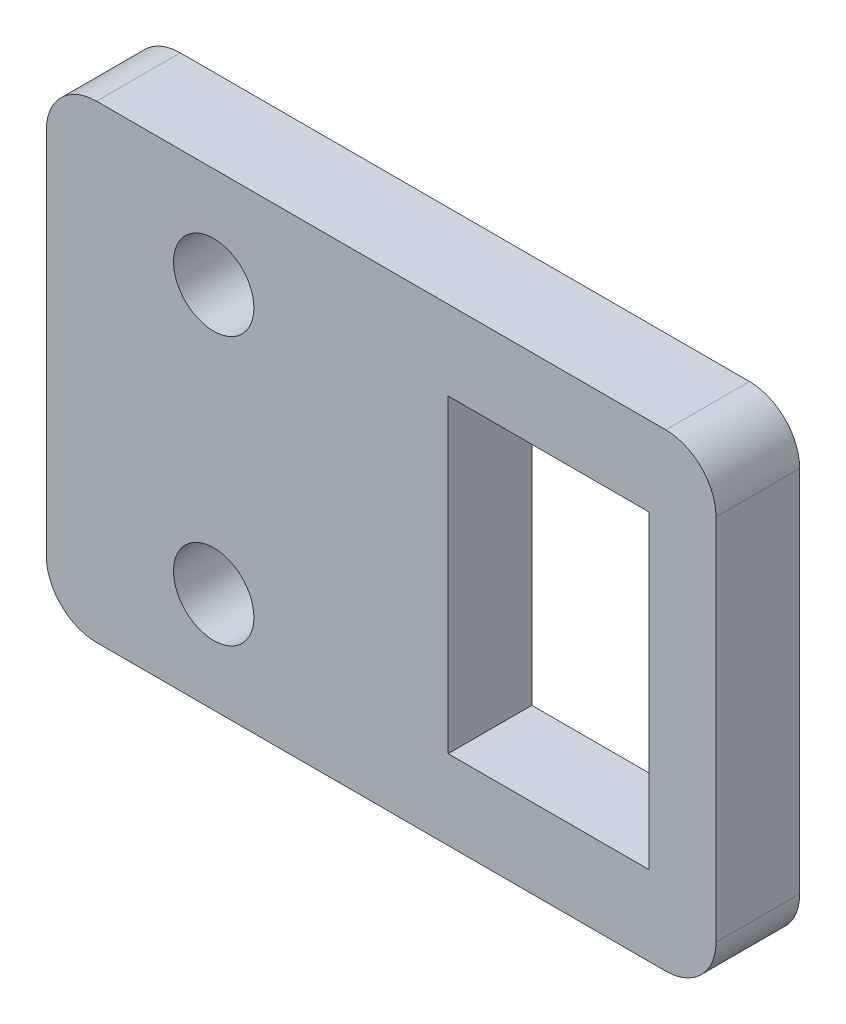
ISO-10303-21;
HEADER;
FILE_DESCRIPTION(('STEP AP214'),'2;1');
FILE_NAME('part.step','',(''),(''),'','','');
FILE_SCHEMA(('AUTOMOTIVE_DESIGN { 1 0 10303 214 1 1 1 1 }'));
ENDSEC;
DATA;
#1=APPLICATION_CONTEXT('core data for automotive mechanical design processes');
#2=APPLICATION_PROTOCOL_DEFINITION('international standard','automotive_design',2000,#1);
#3=PRODUCT_CONTEXT('',#1,'mechanical');
#4=PRODUCT('Part','Part','',(#3));
#5=PRODUCT_RELATED_PRODUCT_CATEGORY('part','',(#4));
#6=PRODUCT_DEFINITION_FORMATION('','',#4);
#7=PRODUCT_DEFINITION_CONTEXT('part definition',#1,'design');
#8=PRODUCT_DEFINITION('design','',#6,#7);
#9=PRODUCT_DEFINITION_SHAPE('','',#8);
#10=(LENGTH_UNIT() NAMED_UNIT(*) SI_UNIT(.MILLI.,.METRE.));
#11=(NAMED_UNIT(*) PLANE_ANGLE_UNIT() SI_UNIT($,.RADIAN.));
#12=(NAMED_UNIT(*) SI_UNIT($,.STERADIAN.) SOLID_ANGLE_UNIT());
#13=UNCERTAINTY_MEASURE_WITH_UNIT(LENGTH_MEASURE(1.E-05),#10,'distance_accuracy_value','');
#14=(GEOMETRIC_REPRESENTATION_CONTEXT(3) GLOBAL_UNCERTAINTY_ASSIGNED_CONTEXT((#13)) GLOBAL_UNIT_ASSIGNED_CONTEXT((#10,
#11,#12)) REPRESENTATION_CONTEXT('',''));
#15=CARTESIAN_POINT('',(0.,0.,0.));
#16=DIRECTION('',(0.,0.,1.));
#17=DIRECTION('',(1.,0.,0.));
#18=AXIS2_PLACEMENT_3D('',#15,#16,#17);
#19=CARTESIAN_POINT('',(0.,0.,5.));
#20=DIRECTION('',(0.,0.,-1.));
#21=DIRECTION('',(-1.,0.,0.));
#22=AXIS2_PLACEMENT_3D('',#19,#20,#21);
#23=PLANE('',#22);
#24=DIRECTION('',(0.,-1.,0.));
#25=VECTOR('',#24,1.);
#26=CARTESIAN_POINT('',(-20.,-14.,5.));
#27=LINE('',#26,#25);
#28=CARTESIAN_POINT('',(-20.,11.,5.));
#29=VERTEX_POINT('',#28);
#30=CARTESIAN_POINT('',(-20.,-11.,5.));
#31=VERTEX_POINT('',#30);
#32=EDGE_CURVE('E174',#29,#31,#27,.T.);
#33=ORIENTED_EDGE('',*,*,#32,.T.);
#34=CARTESIAN_POINT('',(-17.,-11.,5.));
#35=DIRECTION('',(0.,0.,-1.));
#36=DIRECTION('',(-1.,0.,0.));
#37=AXIS2_PLACEMENT_3D('',#34,#35,#36);
#38=CIRCLE('',#37,3.);
#39=CARTESIAN_POINT('',(-17.,-14.,5.));
#40=VERTEX_POINT('',#39);
#41=EDGE_CURVE('E212',#31,#40,#38,.F.);
#42=ORIENTED_EDGE('',*,*,#41,.T.);
#43=DIRECTION('',(1.,0.,0.));
#44=VECTOR('',#43,1.);
#45=CARTESIAN_POINT('',(-20.,-14.,5.));
#46=LINE('',#45,#44);
#47=CARTESIAN_POINT('',(17.,-14.,5.));
#48=VERTEX_POINT('',#47);
#49=EDGE_CURVE('E177',#40,#48,#46,.T.);
#50=ORIENTED_EDGE('',*,*,#49,.T.);
#51=CARTESIAN_POINT('',(17.,-11.,5.));
#52=DIRECTION('',(0.,0.,-1.));
#53=DIRECTION('',(-1.,0.,0.));
#54=AXIS2_PLACEMENT_3D('',#51,#52,#53);
#55=CIRCLE('',#54,3.);
#56=CARTESIAN_POINT('',(20.,-11.,5.));
#57=VERTEX_POINT('',#56);
#58=EDGE_CURVE('E208',#48,#57,#55,.F.);
#59=ORIENTED_EDGE('',*,*,#58,.T.);
#60=DIRECTION('',(0.,1.,0.));
#61=VECTOR('',#60,1.);
#62=CARTESIAN_POINT('',(20.,-14.,5.));
#63=LINE('',#62,#61);
#64=CARTESIAN_POINT('',(20.,11.,5.));
#65=VERTEX_POINT('',#64);
#66=EDGE_CURVE('E169',#57,#65,#63,.T.);
#67=ORIENTED_EDGE('',*,*,#66,.T.);
#68=CARTESIAN_POINT('',(17.,11.,5.));
#69=DIRECTION('',(0.,0.,-1.));
#70=DIRECTION('',(-1.,0.,0.));
#71=AXIS2_PLACEMENT_3D('',#68,#69,#70);
#72=CIRCLE('',#71,3.);
#73=CARTESIAN_POINT('',(17.,14.,5.));
#74=VERTEX_POINT('',#73);
#75=EDGE_CURVE('E55',#65,#74,#72,.F.);
#76=ORIENTED_EDGE('',*,*,#75,.T.);
#77=DIRECTION('',(-1.,0.,0.));
#78=VECTOR('',#77,1.);
#79=CARTESIAN_POINT('',(-20.,14.,5.));
#80=LINE('',#79,#78);
#81=CARTESIAN_POINT('',(-17.,14.,5.));
#82=VERTEX_POINT('',#81);
#83=EDGE_CURVE('E171',#74,#82,#80,.T.);
#84=ORIENTED_EDGE('',*,*,#83,.T.);
#85=CARTESIAN_POINT('',(-17.,11.,5.));
#86=DIRECTION('',(0.,0.,-1.));
#87=DIRECTION('',(-1.,0.,0.));
#88=AXIS2_PLACEMENT_3D('',#85,#86,#87);
#89=CIRCLE('',#88,3.);
#90=EDGE_CURVE('E210',#82,#29,#89,.F.);
#91=ORIENTED_EDGE('',*,*,#90,.T.);
#92=EDGE_LOOP('',(#33,#42,#50,#59,#67,#76,#84,#91));
#93=FACE_BOUND('',#92,.T.);
#94=DIRECTION('',(0.,1.,0.));
#95=VECTOR('',#94,1.);
#96=CARTESIAN_POINT('',(16.,-9.25,5.));
#97=LINE('',#96,#95);
#98=CARTESIAN_POINT('',(16.,-9.25,5.));
#99=VERTEX_POINT('',#98);
#100=CARTESIAN_POINT('',(16.,9.25,5.));
#101=VERTEX_POINT('',#100);
#102=EDGE_CURVE('E125',#99,#101,#97,.T.);
#103=ORIENTED_EDGE('',*,*,#102,.F.);
#104=DIRECTION('',(1.,0.,0.));
#105=VECTOR('',#104,1.);
#106=CARTESIAN_POINT('',(4.,-9.25,5.));
#107=LINE('',#106,#105);
#108=CARTESIAN_POINT('',(4.,-9.25,5.));
#109=VERTEX_POINT('',#108);
#110=EDGE_CURVE('E151',#109,#99,#107,.T.);
#111=ORIENTED_EDGE('',*,*,#110,.F.);
#112=DIRECTION('',(0.,-1.,0.));
#113=VECTOR('',#112,1.);
#114=CARTESIAN_POINT('',(4.,-9.25,5.));
#115=LINE('',#114,#113);
#116=CARTESIAN_POINT('',(4.,9.25,5.));
#117=VERTEX_POINT('',#116);
#118=EDGE_CURVE('E149',#117,#109,#115,.T.);
#119=ORIENTED_EDGE('',*,*,#118,.F.);
#120=DIRECTION('',(-1.,0.,0.));
#121=VECTOR('',#120,1.);
#122=CARTESIAN_POINT('',(4.,9.25,5.));
#123=LINE('',#122,#121);
#124=EDGE_CURVE('E135',#101,#117,#123,.T.);
#125=ORIENTED_EDGE('',*,*,#124,.F.);
#126=EDGE_LOOP('',(#103,#111,#119,#125));
#127=FACE_BOUND('',#126,.T.);
#128=CARTESIAN_POINT('',(-10.,8.,5.));
#129=DIRECTION('',(0.,0.,1.));
#130=DIRECTION('',(1.,0.,0.));
#131=AXIS2_PLACEMENT_3D('',#128,#129,#130);
#132=CIRCLE('',#131,2.4);
#133=CARTESIAN_POINT('',(-7.6,8.,5.));
#134=VERTEX_POINT('',#133);
#135=EDGE_CURVE('E158',#134,#134,#132,.T.);
#136=ORIENTED_EDGE('',*,*,#135,.F.);
#137=EDGE_LOOP('',(#136));
#138=FACE_BOUND('',#137,.T.);
#139=CARTESIAN_POINT('',(-10.,-8.,5.));
#140=DIRECTION('',(0.,0.,1.));
#141=DIRECTION('',(1.,0.,0.));
#142=AXIS2_PLACEMENT_3D('',#139,#140,#141);
#143=CIRCLE('',#142,2.4);
#144=CARTESIAN_POINT('',(-7.6,-8.,5.));
#145=VERTEX_POINT('',#144);
#146=EDGE_CURVE('E394',#145,#145,#143,.T.);
#147=ORIENTED_EDGE('',*,*,#146,.F.);
#148=EDGE_LOOP('',(#147));
#149=FACE_BOUND('',#148,.T.);
#150=ADVANCED_FACE('F33',(#93,#127,#138,#149),#23,.F.);
#151=CARTESIAN_POINT('',(0.,0.,0.));
#152=DIRECTION('',(0.,0.,-1.));
#153=DIRECTION('',(-1.,0.,0.));
#154=AXIS2_PLACEMENT_3D('',#151,#152,#153);
#155=PLANE('',#154);
#156=CARTESIAN_POINT('',(-10.,8.,0.));
#157=DIRECTION('',(0.,0.,1.));
#158=DIRECTION('',(1.,0.,0.));
#159=AXIS2_PLACEMENT_3D('',#156,#157,#158);
#160=CIRCLE('',#159,2.4);
#161=CARTESIAN_POINT('',(-7.6,8.,0.));
#162=VERTEX_POINT('',#161);
#163=EDGE_CURVE('E396',#162,#162,#160,.T.);
#164=ORIENTED_EDGE('',*,*,#163,.T.);
#165=EDGE_LOOP('',(#164));
#166=FACE_BOUND('',#165,.T.);
#167=DIRECTION('',(1.,0.,0.));
#168=VECTOR('',#167,1.);
#169=CARTESIAN_POINT('',(-20.,-14.,0.));
#170=LINE('',#169,#168);
#171=CARTESIAN_POINT('',(-17.,-14.,0.));
#172=VERTEX_POINT('',#171);
#173=CARTESIAN_POINT('',(17.,-14.,0.));
#174=VERTEX_POINT('',#173);
#175=EDGE_CURVE('E172',#172,#174,#170,.T.);
#176=ORIENTED_EDGE('',*,*,#175,.F.);
#177=CARTESIAN_POINT('',(-17.,-11.,0.));
#178=DIRECTION('',(0.,0.,-1.));
#179=DIRECTION('',(-1.,0.,0.));
#180=AXIS2_PLACEMENT_3D('',#177,#178,#179);
#181=CIRCLE('',#180,3.);
#182=CARTESIAN_POINT('',(-20.,-11.,0.));
#183=VERTEX_POINT('',#182);
#184=EDGE_CURVE('E200',#172,#183,#181,.T.);
#185=ORIENTED_EDGE('',*,*,#184,.T.);
#186=DIRECTION('',(0.,-1.,0.));
#187=VECTOR('',#186,1.);
#188=CARTESIAN_POINT('',(-20.,-14.,0.));
#189=LINE('',#188,#187);
#190=CARTESIAN_POINT('',(-20.,11.,0.));
#191=VERTEX_POINT('',#190);
#192=EDGE_CURVE('E185',#191,#183,#189,.T.);
#193=ORIENTED_EDGE('',*,*,#192,.F.);
#194=CARTESIAN_POINT('',(-17.,11.,0.));
#195=DIRECTION('',(0.,0.,-1.));
#196=DIRECTION('',(-1.,0.,0.));
#197=AXIS2_PLACEMENT_3D('',#194,#195,#196);
#198=CIRCLE('',#197,3.);
#199=CARTESIAN_POINT('',(-17.,14.,0.));
#200=VERTEX_POINT('',#199);
#201=EDGE_CURVE('E198',#191,#200,#198,.T.);
#202=ORIENTED_EDGE('',*,*,#201,.T.);
#203=DIRECTION('',(-1.,0.,0.));
#204=VECTOR('',#203,1.);
#205=CARTESIAN_POINT('',(-20.,14.,0.));
#206=LINE('',#205,#204);
#207=CARTESIAN_POINT('',(17.,14.,0.));
#208=VERTEX_POINT('',#207);
#209=EDGE_CURVE('E183',#208,#200,#206,.T.);
#210=ORIENTED_EDGE('',*,*,#209,.F.);
#211=CARTESIAN_POINT('',(17.,11.,0.));
#212=DIRECTION('',(0.,0.,-1.));
#213=DIRECTION('',(-1.,0.,0.));
#214=AXIS2_PLACEMENT_3D('',#211,#212,#213);
#215=CIRCLE('',#214,3.);
#216=CARTESIAN_POINT('',(20.,11.,0.));
#217=VERTEX_POINT('',#216);
#218=EDGE_CURVE('E194',#208,#217,#215,.T.);
#219=ORIENTED_EDGE('',*,*,#218,.T.);
#220=DIRECTION('',(0.,1.,0.));
#221=VECTOR('',#220,1.);
#222=CARTESIAN_POINT('',(20.,-14.,0.));
#223=LINE('',#222,#221);
#224=CARTESIAN_POINT('',(20.,-11.,0.));
#225=VERTEX_POINT('',#224);
#226=EDGE_CURVE('E143',#225,#217,#223,.T.);
#227=ORIENTED_EDGE('',*,*,#226,.F.);
#228=CARTESIAN_POINT('',(17.,-11.,0.));
#229=DIRECTION('',(0.,0.,-1.));
#230=DIRECTION('',(-1.,0.,0.));
#231=AXIS2_PLACEMENT_3D('',#228,#229,#230);
#232=CIRCLE('',#231,3.);
#233=EDGE_CURVE('E196',#225,#174,#232,.T.);
#234=ORIENTED_EDGE('',*,*,#233,.T.);
#235=EDGE_LOOP('',(#176,#185,#193,#202,#210,#219,#227,#234));
#236=FACE_BOUND('',#235,.T.);
#237=DIRECTION('',(1.,0.,0.));
#238=VECTOR('',#237,1.);
#239=CARTESIAN_POINT('',(4.,-9.25,0.));
#240=LINE('',#239,#238);
#241=CARTESIAN_POINT('',(4.,-9.25,0.));
#242=VERTEX_POINT('',#241);
#243=CARTESIAN_POINT('',(16.,-9.25,0.));
#244=VERTEX_POINT('',#243);
#245=EDGE_CURVE('E136',#242,#244,#240,.T.);
#246=ORIENTED_EDGE('',*,*,#245,.T.);
#247=DIRECTION('',(0.,1.,0.));
#248=VECTOR('',#247,1.);
#249=CARTESIAN_POINT('',(16.,-9.25,0.));
#250=LINE('',#249,#248);
#251=CARTESIAN_POINT('',(16.,9.25,0.));
#252=VERTEX_POINT('',#251);
#253=EDGE_CURVE('E156',#244,#252,#250,.T.);
#254=ORIENTED_EDGE('',*,*,#253,.T.);
#255=DIRECTION('',(-1.,0.,0.));
#256=VECTOR('',#255,1.);
#257=CARTESIAN_POINT('',(4.,9.25,0.));
#258=LINE('',#257,#256);
#259=CARTESIAN_POINT('',(4.,9.25,0.));
#260=VERTEX_POINT('',#259);
#261=EDGE_CURVE('E142',#252,#260,#258,.T.);
#262=ORIENTED_EDGE('',*,*,#261,.T.);
#263=DIRECTION('',(0.,-1.,0.));
#264=VECTOR('',#263,1.);
#265=CARTESIAN_POINT('',(4.,-9.25,0.));
#266=LINE('',#265,#264);
#267=EDGE_CURVE('E160',#260,#242,#266,.T.);
#268=ORIENTED_EDGE('',*,*,#267,.T.);
#269=EDGE_LOOP('',(#246,#254,#262,#268));
#270=FACE_BOUND('',#269,.T.);
#271=CARTESIAN_POINT('',(-10.,-8.,0.));
#272=DIRECTION('',(0.,0.,1.));
#273=DIRECTION('',(1.,0.,0.));
#274=AXIS2_PLACEMENT_3D('',#271,#272,#273);
#275=CIRCLE('',#274,2.4);
#276=CARTESIAN_POINT('',(-7.6,-8.,0.));
#277=VERTEX_POINT('',#276);
#278=EDGE_CURVE('E393',#277,#277,#275,.T.);
#279=ORIENTED_EDGE('',*,*,#278,.T.);
#280=EDGE_LOOP('',(#279));
#281=FACE_BOUND('',#280,.T.);
#282=ADVANCED_FACE('F230',(#166,#236,#270,#281),#155,.T.);
#283=CARTESIAN_POINT('',(20.,-14.,5.));
#284=DIRECTION('',(-1.,0.,0.));
#285=DIRECTION('',(0.,0.,1.));
#286=AXIS2_PLACEMENT_3D('',#283,#284,#285);
#287=PLANE('',#286);
#288=ORIENTED_EDGE('',*,*,#66,.F.);
#289=DIRECTION('',(0.,0.,-1.));
#290=VECTOR('',#289,1.);
#291=CARTESIAN_POINT('',(20.,-11.,5.));
#292=LINE('',#291,#290);
#293=EDGE_CURVE('E11',#57,#225,#292,.T.);
#294=ORIENTED_EDGE('',*,*,#293,.T.);
#295=ORIENTED_EDGE('',*,*,#226,.T.);
#296=DIRECTION('',(0.,0.,-1.));
#297=VECTOR('',#296,1.);
#298=CARTESIAN_POINT('',(20.,11.,5.));
#299=LINE('',#298,#297);
#300=EDGE_CURVE('E41',#217,#65,#299,.F.);
#301=ORIENTED_EDGE('',*,*,#300,.T.);
#302=EDGE_LOOP('',(#288,#294,#295,#301));
#303=FACE_BOUND('',#302,.T.);
#304=ADVANCED_FACE('F220',(#303),#287,.F.);
#305=CARTESIAN_POINT('',(-20.,14.,5.));
#306=DIRECTION('',(0.,-1.,0.));
#307=DIRECTION('',(0.,0.,-1.));
#308=AXIS2_PLACEMENT_3D('',#305,#306,#307);
#309=PLANE('',#308);
#310=ORIENTED_EDGE('',*,*,#209,.T.);
#311=DIRECTION('',(0.,0.,-1.));
#312=VECTOR('',#311,1.);
#313=CARTESIAN_POINT('',(-17.,14.,5.));
#314=LINE('',#313,#312);
#315=EDGE_CURVE('E48',#200,#82,#314,.F.);
#316=ORIENTED_EDGE('',*,*,#315,.T.);
#317=ORIENTED_EDGE('',*,*,#83,.F.);
#318=DIRECTION('',(0.,0.,-1.));
#319=VECTOR('',#318,1.);
#320=CARTESIAN_POINT('',(17.,14.,5.));
#321=LINE('',#320,#319);
#322=EDGE_CURVE('E214',#74,#208,#321,.T.);
#323=ORIENTED_EDGE('',*,*,#322,.T.);
#324=EDGE_LOOP('',(#310,#316,#317,#323));
#325=FACE_BOUND('',#324,.T.);
#326=ADVANCED_FACE('F227',(#325),#309,.F.);
#327=CARTESIAN_POINT('',(-20.,-14.,5.));
#328=DIRECTION('',(1.,0.,0.));
#329=DIRECTION('',(0.,0.,-1.));
#330=AXIS2_PLACEMENT_3D('',#327,#328,#329);
#331=PLANE('',#330);
#332=ORIENTED_EDGE('',*,*,#192,.T.);
#333=DIRECTION('',(0.,0.,-1.));
#334=VECTOR('',#333,1.);
#335=CARTESIAN_POINT('',(-20.,-11.,5.));
#336=LINE('',#335,#334);
#337=EDGE_CURVE('E205',#183,#31,#336,.F.);
#338=ORIENTED_EDGE('',*,*,#337,.T.);
#339=ORIENTED_EDGE('',*,*,#32,.F.);
#340=DIRECTION('',(0.,0.,-1.));
#341=VECTOR('',#340,1.);
#342=CARTESIAN_POINT('',(-20.,11.,5.));
#343=LINE('',#342,#341);
#344=EDGE_CURVE('E202',#29,#191,#343,.T.);
#345=ORIENTED_EDGE('',*,*,#344,.T.);
#346=EDGE_LOOP('',(#332,#338,#339,#345));
#347=FACE_BOUND('',#346,.T.);
#348=ADVANCED_FACE('F239',(#347),#331,.F.);
#349=CARTESIAN_POINT('',(-20.,-14.,5.));
#350=DIRECTION('',(0.,1.,0.));
#351=DIRECTION('',(0.,0.,1.));
#352=AXIS2_PLACEMENT_3D('',#349,#350,#351);
#353=PLANE('',#352);
#354=ORIENTED_EDGE('',*,*,#49,.F.);
#355=DIRECTION('',(0.,0.,-1.));
#356=VECTOR('',#355,1.);
#357=CARTESIAN_POINT('',(-17.,-14.,5.));
#358=LINE('',#357,#356);
#359=EDGE_CURVE('E191',#40,#172,#358,.T.);
#360=ORIENTED_EDGE('',*,*,#359,.T.);
#361=ORIENTED_EDGE('',*,*,#175,.T.);
#362=DIRECTION('',(0.,0.,-1.));
#363=VECTOR('',#362,1.);
#364=CARTESIAN_POINT('',(17.,-14.,5.));
#365=LINE('',#364,#363);
#366=EDGE_CURVE('E180',#174,#48,#365,.F.);
#367=ORIENTED_EDGE('',*,*,#366,.T.);
#368=EDGE_LOOP('',(#354,#360,#361,#367));
#369=FACE_BOUND('',#368,.T.);
#370=ADVANCED_FACE('F247',(#369),#353,.F.);
#371=CARTESIAN_POINT('',(16.,-9.25,5.));
#372=DIRECTION('',(-1.,0.,0.));
#373=DIRECTION('',(0.,0.,1.));
#374=AXIS2_PLACEMENT_3D('',#371,#372,#373);
#375=PLANE('',#374);
#376=ORIENTED_EDGE('',*,*,#253,.F.);
#377=DIRECTION('',(0.,0.,-1.));
#378=VECTOR('',#377,1.);
#379=CARTESIAN_POINT('',(16.,-9.25,5.));
#380=LINE('',#379,#378);
#381=EDGE_CURVE('E131',#99,#244,#380,.T.);
#382=ORIENTED_EDGE('',*,*,#381,.F.);
#383=ORIENTED_EDGE('',*,*,#102,.T.);
#384=DIRECTION('',(0.,0.,-1.));
#385=VECTOR('',#384,1.);
#386=CARTESIAN_POINT('',(16.,9.25,5.));
#387=LINE('',#386,#385);
#388=EDGE_CURVE('E128',#101,#252,#387,.T.);
#389=ORIENTED_EDGE('',*,*,#388,.T.);
#390=EDGE_LOOP('',(#376,#382,#383,#389));
#391=FACE_BOUND('',#390,.T.);
#392=ADVANCED_FACE('F127',(#391),#375,.T.);
#393=CARTESIAN_POINT('',(4.,9.25,5.));
#394=DIRECTION('',(0.,-1.,0.));
#395=DIRECTION('',(0.,0.,-1.));
#396=AXIS2_PLACEMENT_3D('',#393,#394,#395);
#397=PLANE('',#396);
#398=ORIENTED_EDGE('',*,*,#261,.F.);
#399=ORIENTED_EDGE('',*,*,#388,.F.);
#400=ORIENTED_EDGE('',*,*,#124,.T.);
#401=DIRECTION('',(0.,0.,-1.));
#402=VECTOR('',#401,1.);
#403=CARTESIAN_POINT('',(4.,9.25,5.));
#404=LINE('',#403,#402);
#405=EDGE_CURVE('E144',#117,#260,#404,.T.);
#406=ORIENTED_EDGE('',*,*,#405,.T.);
#407=EDGE_LOOP('',(#398,#399,#400,#406));
#408=FACE_BOUND('',#407,.T.);
#409=ADVANCED_FACE('F139',(#408),#397,.T.);
#410=CARTESIAN_POINT('',(4.,-9.25,5.));
#411=DIRECTION('',(1.,0.,0.));
#412=DIRECTION('',(0.,0.,-1.));
#413=AXIS2_PLACEMENT_3D('',#410,#411,#412);
#414=PLANE('',#413);
#415=ORIENTED_EDGE('',*,*,#267,.F.);
#416=ORIENTED_EDGE('',*,*,#405,.F.);
#417=ORIENTED_EDGE('',*,*,#118,.T.);
#418=DIRECTION('',(0.,0.,-1.));
#419=VECTOR('',#418,1.);
#420=CARTESIAN_POINT('',(4.,-9.25,5.));
#421=LINE('',#420,#419);
#422=EDGE_CURVE('E166',#109,#242,#421,.T.);
#423=ORIENTED_EDGE('',*,*,#422,.T.);
#424=EDGE_LOOP('',(#415,#416,#417,#423));
#425=FACE_BOUND('',#424,.T.);
#426=ADVANCED_FACE('F294',(#425),#414,.T.);
#427=CARTESIAN_POINT('',(4.,-9.25,5.));
#428=DIRECTION('',(0.,1.,0.));
#429=DIRECTION('',(0.,0.,1.));
#430=AXIS2_PLACEMENT_3D('',#427,#428,#429);
#431=PLANE('',#430);
#432=ORIENTED_EDGE('',*,*,#245,.F.);
#433=ORIENTED_EDGE('',*,*,#422,.F.);
#434=ORIENTED_EDGE('',*,*,#110,.T.);
#435=ORIENTED_EDGE('',*,*,#381,.T.);
#436=EDGE_LOOP('',(#432,#433,#434,#435));
#437=FACE_BOUND('',#436,.T.);
#438=ADVANCED_FACE('F286',(#437),#431,.T.);
#439=CARTESIAN_POINT('',(-10.,8.,5.));
#440=DIRECTION('',(0.,0.,-1.));
#441=DIRECTION('',(-1.,0.,0.));
#442=AXIS2_PLACEMENT_3D('',#439,#440,#441);
#443=CYLINDRICAL_SURFACE('',#442,2.4);
#444=ORIENTED_EDGE('',*,*,#135,.T.);
#445=EDGE_LOOP('',(#444));
#446=FACE_BOUND('',#445,.T.);
#447=ORIENTED_EDGE('',*,*,#163,.F.);
#448=EDGE_LOOP('',(#447));
#449=FACE_BOUND('',#448,.T.);
#450=ADVANCED_FACE('F280',(#446,#449),#443,.F.);
#451=CARTESIAN_POINT('',(-10.,-8.,5.));
#452=DIRECTION('',(0.,0.,-1.));
#453=DIRECTION('',(-1.,0.,0.));
#454=AXIS2_PLACEMENT_3D('',#451,#452,#453);
#455=CYLINDRICAL_SURFACE('',#454,2.4);
#456=ORIENTED_EDGE('',*,*,#146,.T.);
#457=EDGE_LOOP('',(#456));
#458=FACE_BOUND('',#457,.T.);
#459=ORIENTED_EDGE('',*,*,#278,.F.);
#460=EDGE_LOOP('',(#459));
#461=FACE_BOUND('',#460,.T.);
#462=ADVANCED_FACE('F276',(#458,#461),#455,.F.);
#463=CARTESIAN_POINT('',(-17.,-11.,5.));
#464=DIRECTION('',(0.,0.,-1.));
#465=DIRECTION('',(-1.,0.,0.));
#466=AXIS2_PLACEMENT_3D('',#463,#464,#465);
#467=CYLINDRICAL_SURFACE('',#466,3.);
#468=ORIENTED_EDGE('',*,*,#41,.F.);
#469=ORIENTED_EDGE('',*,*,#337,.F.);
#470=ORIENTED_EDGE('',*,*,#184,.F.);
#471=ORIENTED_EDGE('',*,*,#359,.F.);
#472=EDGE_LOOP('',(#468,#469,#470,#471));
#473=FACE_BOUND('',#472,.T.);
#474=ADVANCED_FACE('F245',(#473),#467,.T.);
#475=CARTESIAN_POINT('',(-17.,11.,5.));
#476=DIRECTION('',(0.,0.,-1.));
#477=DIRECTION('',(-1.,0.,0.));
#478=AXIS2_PLACEMENT_3D('',#475,#476,#477);
#479=CYLINDRICAL_SURFACE('',#478,3.);
#480=ORIENTED_EDGE('',*,*,#90,.F.);
#481=ORIENTED_EDGE('',*,*,#315,.F.);
#482=ORIENTED_EDGE('',*,*,#201,.F.);
#483=ORIENTED_EDGE('',*,*,#344,.F.);
#484=EDGE_LOOP('',(#480,#481,#482,#483));
#485=FACE_BOUND('',#484,.T.);
#486=ADVANCED_FACE('F236',(#485),#479,.T.);
#487=CARTESIAN_POINT('',(17.,-11.,5.));
#488=DIRECTION('',(0.,0.,-1.));
#489=DIRECTION('',(-1.,0.,0.));
#490=AXIS2_PLACEMENT_3D('',#487,#488,#489);
#491=CYLINDRICAL_SURFACE('',#490,3.);
#492=ORIENTED_EDGE('',*,*,#58,.F.);
#493=ORIENTED_EDGE('',*,*,#366,.F.);
#494=ORIENTED_EDGE('',*,*,#233,.F.);
#495=ORIENTED_EDGE('',*,*,#293,.F.);
#496=EDGE_LOOP('',(#492,#493,#494,#495));
#497=FACE_BOUND('',#496,.T.);
#498=ADVANCED_FACE('F250',(#497),#491,.T.);
#499=CARTESIAN_POINT('',(17.,11.,5.));
#500=DIRECTION('',(0.,0.,-1.));
#501=DIRECTION('',(-1.,0.,0.));
#502=AXIS2_PLACEMENT_3D('',#499,#500,#501);
#503=CYLINDRICAL_SURFACE('',#502,3.);
#504=ORIENTED_EDGE('',*,*,#75,.F.);
#505=ORIENTED_EDGE('',*,*,#300,.F.);
#506=ORIENTED_EDGE('',*,*,#218,.F.);
#507=ORIENTED_EDGE('',*,*,#322,.F.);
#508=EDGE_LOOP('',(#504,#505,#506,#507));
#509=FACE_BOUND('',#508,.T.);
#510=ADVANCED_FACE('F35',(#509),#503,.T.);
#511=CLOSED_SHELL('',(#150,#282,#304,#326,#348,#370,#392,#409,#426,#438,#450,#462,#474,#486,
#498,#510));
#512=MANIFOLD_SOLID_BREP('B2',#511);
#513=ADVANCED_BREP_SHAPE_REPRESENTATION('',(#18,#512),#14);
#514=SHAPE_DEFINITION_REPRESENTATION(#9,#513);
ENDSEC;
END-ISO-10303-21;
